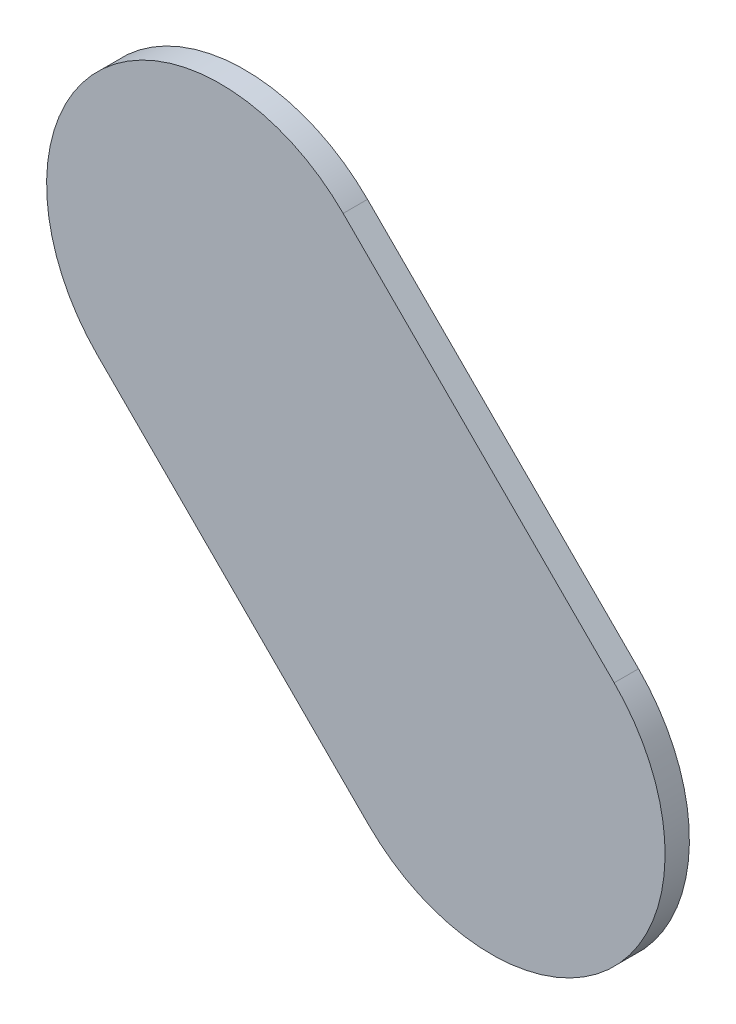
ISO-10303-21;
HEADER;
FILE_DESCRIPTION(('STEP AP214'),'2;1');
FILE_NAME('part.step','',(''),(''),'','','');
FILE_SCHEMA(('AUTOMOTIVE_DESIGN { 1 0 10303 214 1 1 1 1 }'));
ENDSEC;
DATA;
#1=APPLICATION_CONTEXT('core data for automotive mechanical design processes');
#2=APPLICATION_PROTOCOL_DEFINITION('international standard','automotive_design',2000,#1);
#3=PRODUCT_CONTEXT('',#1,'mechanical');
#4=PRODUCT('Part','Part','',(#3));
#5=PRODUCT_RELATED_PRODUCT_CATEGORY('part','',(#4));
#6=PRODUCT_DEFINITION_FORMATION('','',#4);
#7=PRODUCT_DEFINITION_CONTEXT('part definition',#1,'design');
#8=PRODUCT_DEFINITION('design','',#6,#7);
#9=PRODUCT_DEFINITION_SHAPE('','',#8);
#10=(LENGTH_UNIT() NAMED_UNIT(*) SI_UNIT(.MILLI.,.METRE.));
#11=(NAMED_UNIT(*) PLANE_ANGLE_UNIT() SI_UNIT($,.RADIAN.));
#12=(NAMED_UNIT(*) SI_UNIT($,.STERADIAN.) SOLID_ANGLE_UNIT());
#13=UNCERTAINTY_MEASURE_WITH_UNIT(LENGTH_MEASURE(1.E-05),#10,'distance_accuracy_value','');
#14=(GEOMETRIC_REPRESENTATION_CONTEXT(3) GLOBAL_UNCERTAINTY_ASSIGNED_CONTEXT((#13)) GLOBAL_UNIT_ASSIGNED_CONTEXT((#10,
#11,#12)) REPRESENTATION_CONTEXT('',''));
#15=CARTESIAN_POINT('',(0.,0.,0.));
#16=DIRECTION('',(0.,0.,1.));
#17=DIRECTION('',(1.,0.,0.));
#18=AXIS2_PLACEMENT_3D('',#15,#16,#17);
#19=CARTESIAN_POINT('',(136.432757,-114.596776,1.635));
#20=DIRECTION('',(0.,0.,1.));
#21=DIRECTION('',(1.,0.,0.));
#22=AXIS2_PLACEMENT_3D('',#19,#20,#21);
#23=PLANE('',#22);
#24=DIRECTION('',(0.707106781186548,-0.707106781186548,0.));
#25=VECTOR('',#24,1.);
#26=CARTESIAN_POINT('',(136.432757,-114.596776,1.635));
#27=LINE('',#26,#25);
#28=CARTESIAN_POINT('',(136.432757,-114.596776,1.635));
#29=VERTEX_POINT('',#28);
#30=CARTESIAN_POINT('',(136.822757,-114.986776,1.635));
#31=VERTEX_POINT('',#30);
#32=EDGE_CURVE('E72',#29,#31,#27,.T.);
#33=ORIENTED_EDGE('',*,*,#32,.T.);
#34=CARTESIAN_POINT('',(136.9995335,-114.8099995,1.635));
#35=DIRECTION('',(0.,0.,1.));
#36=DIRECTION('',(-0.707106781186548,-0.707106781186548,0.));
#37=AXIS2_PLACEMENT_3D('',#34,#35,#36);
#38=CIRCLE('',#37,0.249999723809);
#39=CARTESIAN_POINT('',(137.17631,-114.633223,1.635));
#40=VERTEX_POINT('',#39);
#41=EDGE_CURVE('E100',#31,#40,#38,.T.);
#42=ORIENTED_EDGE('',*,*,#41,.T.);
#43=DIRECTION('',(-0.707106781186548,0.707106781186548,0.));
#44=VECTOR('',#43,1.);
#45=CARTESIAN_POINT('',(137.17631,-114.633223,1.635));
#46=LINE('',#45,#44);
#47=CARTESIAN_POINT('',(136.78631,-114.243223,1.635));
#48=VERTEX_POINT('',#47);
#49=EDGE_CURVE('E20',#40,#48,#46,.T.);
#50=ORIENTED_EDGE('',*,*,#49,.T.);
#51=CARTESIAN_POINT('',(136.6095335,-114.4199995,1.635));
#52=DIRECTION('',(0.,0.,1.));
#53=DIRECTION('',(0.707106781186548,0.707106781186548,0.));
#54=AXIS2_PLACEMENT_3D('',#51,#52,#53);
#55=CIRCLE('',#54,0.249999723809);
#56=EDGE_CURVE('E11',#48,#29,#55,.T.);
#57=ORIENTED_EDGE('',*,*,#56,.T.);
#58=EDGE_LOOP('',(#33,#42,#50,#57));
#59=FACE_BOUND('',#58,.T.);
#60=ADVANCED_FACE('F17',(#59),#23,.T.);
#61=CARTESIAN_POINT('',(136.432757,-114.596776,1.6));
#62=DIRECTION('',(0.,0.,1.));
#63=DIRECTION('',(1.,0.,0.));
#64=AXIS2_PLACEMENT_3D('',#61,#62,#63);
#65=PLANE('',#64);
#66=CARTESIAN_POINT('',(136.6095335,-114.4199995,1.6));
#67=DIRECTION('',(0.,0.,1.));
#68=DIRECTION('',(0.707106781186548,0.707106781186548,0.));
#69=AXIS2_PLACEMENT_3D('',#66,#67,#68);
#70=CIRCLE('',#69,0.249999723809);
#71=CARTESIAN_POINT('',(136.78631,-114.243223,1.6));
#72=VERTEX_POINT('',#71);
#73=CARTESIAN_POINT('',(136.432757,-114.596776,1.6));
#74=VERTEX_POINT('',#73);
#75=EDGE_CURVE('E26',#72,#74,#70,.T.);
#76=ORIENTED_EDGE('',*,*,#75,.F.);
#77=DIRECTION('',(-0.707106781186548,0.707106781186548,0.));
#78=VECTOR('',#77,1.);
#79=CARTESIAN_POINT('',(137.17631,-114.633223,1.6));
#80=LINE('',#79,#78);
#81=CARTESIAN_POINT('',(137.17631,-114.633223,1.6));
#82=VERTEX_POINT('',#81);
#83=EDGE_CURVE('E96',#82,#72,#80,.T.);
#84=ORIENTED_EDGE('',*,*,#83,.F.);
#85=CARTESIAN_POINT('',(136.9995335,-114.8099995,1.6));
#86=DIRECTION('',(0.,0.,1.));
#87=DIRECTION('',(-0.707106781186548,-0.707106781186548,0.));
#88=AXIS2_PLACEMENT_3D('',#85,#86,#87);
#89=CIRCLE('',#88,0.249999723809);
#90=CARTESIAN_POINT('',(136.822757,-114.986776,1.6));
#91=VERTEX_POINT('',#90);
#92=EDGE_CURVE('E81',#91,#82,#89,.T.);
#93=ORIENTED_EDGE('',*,*,#92,.F.);
#94=DIRECTION('',(0.707106781186548,-0.707106781186548,0.));
#95=VECTOR('',#94,1.);
#96=CARTESIAN_POINT('',(136.432757,-114.596776,1.6));
#97=LINE('',#96,#95);
#98=EDGE_CURVE('E92',#74,#91,#97,.T.);
#99=ORIENTED_EDGE('',*,*,#98,.F.);
#100=EDGE_LOOP('',(#76,#84,#93,#99));
#101=FACE_BOUND('',#100,.T.);
#102=ADVANCED_FACE('F158',(#101),#65,.F.);
#103=CARTESIAN_POINT('',(136.6095335,-114.4199995,1.6));
#104=DIRECTION('',(0.,0.,-1.));
#105=DIRECTION('',(0.707106781186548,0.707106781186548,0.));
#106=AXIS2_PLACEMENT_3D('',#103,#104,#105);
#107=CYLINDRICAL_SURFACE('',#106,0.249999723809);
#108=ORIENTED_EDGE('',*,*,#75,.T.);
#109=DIRECTION('',(0.,0.,1.));
#110=VECTOR('',#109,1.);
#111=CARTESIAN_POINT('',(136.432757,-114.596776,1.6));
#112=LINE('',#111,#110);
#113=EDGE_CURVE('E76',#74,#29,#112,.T.);
#114=ORIENTED_EDGE('',*,*,#113,.T.);
#115=ORIENTED_EDGE('',*,*,#56,.F.);
#116=DIRECTION('',(0.,0.,1.));
#117=VECTOR('',#116,1.);
#118=CARTESIAN_POINT('',(136.78631,-114.243223,1.6));
#119=LINE('',#118,#117);
#120=EDGE_CURVE('E99',#72,#48,#119,.T.);
#121=ORIENTED_EDGE('',*,*,#120,.F.);
#122=EDGE_LOOP('',(#108,#114,#115,#121));
#123=FACE_BOUND('',#122,.T.);
#124=ADVANCED_FACE('F77',(#123),#107,.T.);
#125=CARTESIAN_POINT('',(137.17631,-114.633223,1.6));
#126=DIRECTION('',(-0.707106781186548,-0.707106781186548,0.));
#127=DIRECTION('',(-0.707106781186548,0.707106781186548,0.));
#128=AXIS2_PLACEMENT_3D('',#125,#126,#127);
#129=PLANE('',#128);
#130=ORIENTED_EDGE('',*,*,#83,.T.);
#131=ORIENTED_EDGE('',*,*,#120,.T.);
#132=ORIENTED_EDGE('',*,*,#49,.F.);
#133=DIRECTION('',(0.,0.,1.));
#134=VECTOR('',#133,1.);
#135=CARTESIAN_POINT('',(137.17631,-114.633223,1.6));
#136=LINE('',#135,#134);
#137=EDGE_CURVE('E107',#82,#40,#136,.T.);
#138=ORIENTED_EDGE('',*,*,#137,.F.);
#139=EDGE_LOOP('',(#130,#131,#132,#138));
#140=FACE_BOUND('',#139,.T.);
#141=ADVANCED_FACE('F119',(#140),#129,.F.);
#142=CARTESIAN_POINT('',(136.9995335,-114.8099995,1.6));
#143=DIRECTION('',(0.,0.,-1.));
#144=DIRECTION('',(-0.707106781186548,-0.707106781186548,0.));
#145=AXIS2_PLACEMENT_3D('',#142,#143,#144);
#146=CYLINDRICAL_SURFACE('',#145,0.249999723809);
#147=ORIENTED_EDGE('',*,*,#92,.T.);
#148=ORIENTED_EDGE('',*,*,#137,.T.);
#149=ORIENTED_EDGE('',*,*,#41,.F.);
#150=DIRECTION('',(0.,0.,1.));
#151=VECTOR('',#150,1.);
#152=CARTESIAN_POINT('',(136.822757,-114.986776,1.6));
#153=LINE('',#152,#151);
#154=EDGE_CURVE('E85',#91,#31,#153,.T.);
#155=ORIENTED_EDGE('',*,*,#154,.F.);
#156=EDGE_LOOP('',(#147,#148,#149,#155));
#157=FACE_BOUND('',#156,.T.);
#158=ADVANCED_FACE('F117',(#157),#146,.T.);
#159=CARTESIAN_POINT('',(136.432757,-114.596776,1.6));
#160=DIRECTION('',(0.707106781186548,0.707106781186548,0.));
#161=DIRECTION('',(0.,0.,-1.));
#162=AXIS2_PLACEMENT_3D('',#159,#160,#161);
#163=PLANE('',#162);
#164=ORIENTED_EDGE('',*,*,#98,.T.);
#165=ORIENTED_EDGE('',*,*,#154,.T.);
#166=ORIENTED_EDGE('',*,*,#32,.F.);
#167=ORIENTED_EDGE('',*,*,#113,.F.);
#168=EDGE_LOOP('',(#164,#165,#166,#167));
#169=FACE_BOUND('',#168,.T.);
#170=ADVANCED_FACE('F83',(#169),#163,.F.);
#171=CLOSED_SHELL('',(#60,#102,#124,#141,#158,#170));
#172=MANIFOLD_SOLID_BREP('B1',#171);
#173=ADVANCED_BREP_SHAPE_REPRESENTATION('',(#18,#172),#14);
#174=SHAPE_DEFINITION_REPRESENTATION(#9,#173);
ENDSEC;
END-ISO-10303-21;
